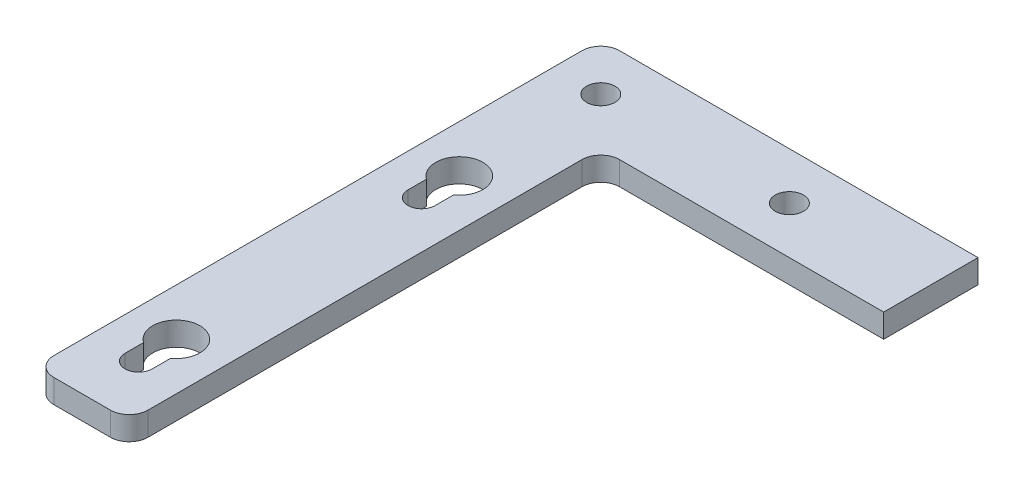
ISO-10303-21;
HEADER;
FILE_DESCRIPTION(('STEP AP214'),'2;1');
FILE_NAME('part.step','',(''),(''),'','','');
FILE_SCHEMA(('AUTOMOTIVE_DESIGN { 1 0 10303 214 1 1 1 1 }'));
ENDSEC;
DATA;
#1=APPLICATION_CONTEXT('core data for automotive mechanical design processes');
#2=APPLICATION_PROTOCOL_DEFINITION('international standard','automotive_design',2000,#1);
#3=PRODUCT_CONTEXT('',#1,'mechanical');
#4=PRODUCT('Part','Part','',(#3));
#5=PRODUCT_RELATED_PRODUCT_CATEGORY('part','',(#4));
#6=PRODUCT_DEFINITION_FORMATION('','',#4);
#7=PRODUCT_DEFINITION_CONTEXT('part definition',#1,'design');
#8=PRODUCT_DEFINITION('design','',#6,#7);
#9=PRODUCT_DEFINITION_SHAPE('','',#8);
#10=(LENGTH_UNIT() NAMED_UNIT(*) SI_UNIT(.MILLI.,.METRE.));
#11=(NAMED_UNIT(*) PLANE_ANGLE_UNIT() SI_UNIT($,.RADIAN.));
#12=(NAMED_UNIT(*) SI_UNIT($,.STERADIAN.) SOLID_ANGLE_UNIT());
#13=UNCERTAINTY_MEASURE_WITH_UNIT(LENGTH_MEASURE(1.E-05),#10,'distance_accuracy_value','');
#14=(GEOMETRIC_REPRESENTATION_CONTEXT(3) GLOBAL_UNCERTAINTY_ASSIGNED_CONTEXT((#13)) GLOBAL_UNIT_ASSIGNED_CONTEXT((#10,
#11,#12)) REPRESENTATION_CONTEXT('',''));
#15=CARTESIAN_POINT('',(0.,0.,0.));
#16=DIRECTION('',(0.,0.,1.));
#17=DIRECTION('',(1.,0.,0.));
#18=AXIS2_PLACEMENT_3D('',#15,#16,#17);
#19=CARTESIAN_POINT('',(0.,3.175,-76.2));
#20=DIRECTION('',(0.,0.,-1.));
#21=DIRECTION('',(-1.,0.,0.));
#22=AXIS2_PLACEMENT_3D('',#19,#20,#21);
#23=PLANE('',#22);
#24=DIRECTION('',(1.,0.,0.));
#25=VECTOR('',#24,1.);
#26=CARTESIAN_POINT('',(0.,0.,-76.2));
#27=LINE('',#26,#25);
#28=CARTESIAN_POINT('',(2.54,0.,-76.2));
#29=VERTEX_POINT('',#28);
#30=CARTESIAN_POINT('',(50.8,0.,-76.2));
#31=VERTEX_POINT('',#30);
#32=EDGE_CURVE('E255',#29,#31,#27,.T.);
#33=ORIENTED_EDGE('',*,*,#32,.F.);
#34=DIRECTION('',(0.,-1.,0.));
#35=VECTOR('',#34,1.);
#36=CARTESIAN_POINT('',(2.54,3.175,-76.2));
#37=LINE('',#36,#35);
#38=CARTESIAN_POINT('',(2.54,3.175,-76.2));
#39=VERTEX_POINT('',#38);
#40=EDGE_CURVE('E322',#29,#39,#37,.F.);
#41=ORIENTED_EDGE('',*,*,#40,.T.);
#42=DIRECTION('',(1.,0.,0.));
#43=VECTOR('',#42,1.);
#44=CARTESIAN_POINT('',(0.,3.175,-76.2));
#45=LINE('',#44,#43);
#46=CARTESIAN_POINT('',(50.8,3.175,-76.2));
#47=VERTEX_POINT('',#46);
#48=EDGE_CURVE('E258',#39,#47,#45,.T.);
#49=ORIENTED_EDGE('',*,*,#48,.T.);
#50=DIRECTION('',(0.,-1.,0.));
#51=VECTOR('',#50,1.);
#52=CARTESIAN_POINT('',(50.8,3.175,-76.2));
#53=LINE('',#52,#51);
#54=EDGE_CURVE('E274',#47,#31,#53,.T.);
#55=ORIENTED_EDGE('',*,*,#54,.T.);
#56=EDGE_LOOP('',(#33,#41,#49,#55));
#57=FACE_BOUND('',#56,.T.);
#58=ADVANCED_FACE('F49',(#57),#23,.T.);
#59=CARTESIAN_POINT('',(0.,3.175,0.));
#60=DIRECTION('',(-1.,0.,0.));
#61=DIRECTION('',(0.,0.,1.));
#62=AXIS2_PLACEMENT_3D('',#59,#60,#61);
#63=PLANE('',#62);
#64=DIRECTION('',(0.,0.,-1.));
#65=VECTOR('',#64,1.);
#66=CARTESIAN_POINT('',(0.,0.,0.));
#67=LINE('',#66,#65);
#68=CARTESIAN_POINT('',(0.,0.,-2.54));
#69=VERTEX_POINT('',#68);
#70=CARTESIAN_POINT('',(0.,0.,-73.66));
#71=VERTEX_POINT('',#70);
#72=EDGE_CURVE('E276',#69,#71,#67,.T.);
#73=ORIENTED_EDGE('',*,*,#72,.F.);
#74=DIRECTION('',(0.,-1.,0.));
#75=VECTOR('',#74,1.);
#76=CARTESIAN_POINT('',(0.,3.175,-2.54));
#77=LINE('',#76,#75);
#78=CARTESIAN_POINT('',(0.,3.175,-2.54));
#79=VERTEX_POINT('',#78);
#80=EDGE_CURVE('E71',#69,#79,#77,.F.);
#81=ORIENTED_EDGE('',*,*,#80,.T.);
#82=DIRECTION('',(0.,0.,-1.));
#83=VECTOR('',#82,1.);
#84=CARTESIAN_POINT('',(0.,3.175,0.));
#85=LINE('',#84,#83);
#86=CARTESIAN_POINT('',(0.,3.175,-73.66));
#87=VERTEX_POINT('',#86);
#88=EDGE_CURVE('E260',#79,#87,#85,.T.);
#89=ORIENTED_EDGE('',*,*,#88,.T.);
#90=DIRECTION('',(0.,-1.,0.));
#91=VECTOR('',#90,1.);
#92=CARTESIAN_POINT('',(0.,3.175,-73.66));
#93=LINE('',#92,#91);
#94=EDGE_CURVE('E318',#87,#71,#93,.T.);
#95=ORIENTED_EDGE('',*,*,#94,.T.);
#96=EDGE_LOOP('',(#73,#81,#89,#95));
#97=FACE_BOUND('',#96,.T.);
#98=ADVANCED_FACE('F349',(#97),#63,.T.);
#99=CARTESIAN_POINT('',(0.,3.175,0.));
#100=DIRECTION('',(0.,0.,-1.));
#101=DIRECTION('',(-1.,0.,0.));
#102=AXIS2_PLACEMENT_3D('',#99,#100,#101);
#103=PLANE('',#102);
#104=DIRECTION('',(1.,0.,0.));
#105=VECTOR('',#104,1.);
#106=CARTESIAN_POINT('',(0.,0.,0.));
#107=LINE('',#106,#105);
#108=CARTESIAN_POINT('',(2.54,0.,0.));
#109=VERTEX_POINT('',#108);
#110=CARTESIAN_POINT('',(10.16,0.,0.));
#111=VERTEX_POINT('',#110);
#112=EDGE_CURVE('E279',#109,#111,#107,.T.);
#113=ORIENTED_EDGE('',*,*,#112,.T.);
#114=DIRECTION('',(0.,-1.,0.));
#115=VECTOR('',#114,1.);
#116=CARTESIAN_POINT('',(10.16,3.175,0.));
#117=LINE('',#116,#115);
#118=CARTESIAN_POINT('',(10.16,3.175,0.));
#119=VERTEX_POINT('',#118);
#120=EDGE_CURVE('E311',#111,#119,#117,.F.);
#121=ORIENTED_EDGE('',*,*,#120,.T.);
#122=DIRECTION('',(1.,0.,0.));
#123=VECTOR('',#122,1.);
#124=CARTESIAN_POINT('',(0.,3.175,0.));
#125=LINE('',#124,#123);
#126=CARTESIAN_POINT('',(2.54,3.175,0.));
#127=VERTEX_POINT('',#126);
#128=EDGE_CURVE('E263',#127,#119,#125,.T.);
#129=ORIENTED_EDGE('',*,*,#128,.F.);
#130=DIRECTION('',(0.,-1.,0.));
#131=VECTOR('',#130,1.);
#132=CARTESIAN_POINT('',(2.54,0.,0.));
#133=LINE('',#132,#131);
#134=EDGE_CURVE('E308',#127,#109,#133,.T.);
#135=ORIENTED_EDGE('',*,*,#134,.T.);
#136=EDGE_LOOP('',(#113,#121,#129,#135));
#137=FACE_BOUND('',#136,.T.);
#138=ADVANCED_FACE('F358',(#137),#103,.F.);
#139=CARTESIAN_POINT('',(12.7,3.175,0.));
#140=DIRECTION('',(-1.,0.,0.));
#141=DIRECTION('',(0.,0.,1.));
#142=AXIS2_PLACEMENT_3D('',#139,#140,#141);
#143=PLANE('',#142);
#144=DIRECTION('',(0.,0.,-1.));
#145=VECTOR('',#144,1.);
#146=CARTESIAN_POINT('',(12.7,0.,0.));
#147=LINE('',#146,#145);
#148=CARTESIAN_POINT('',(12.7,0.,-2.54));
#149=VERTEX_POINT('',#148);
#150=CARTESIAN_POINT('',(12.7,0.,-60.96));
#151=VERTEX_POINT('',#150);
#152=EDGE_CURVE('E282',#149,#151,#147,.T.);
#153=ORIENTED_EDGE('',*,*,#152,.T.);
#154=DIRECTION('',(0.,-1.,0.));
#155=VECTOR('',#154,1.);
#156=CARTESIAN_POINT('',(12.7,3.175,-60.96));
#157=LINE('',#156,#155);
#158=CARTESIAN_POINT('',(12.7,3.175,-60.96));
#159=VERTEX_POINT('',#158);
#160=EDGE_CURVE('E300',#151,#159,#157,.F.);
#161=ORIENTED_EDGE('',*,*,#160,.T.);
#162=DIRECTION('',(0.,0.,-1.));
#163=VECTOR('',#162,1.);
#164=CARTESIAN_POINT('',(12.7,3.175,0.));
#165=LINE('',#164,#163);
#166=CARTESIAN_POINT('',(12.7,3.175,-2.54));
#167=VERTEX_POINT('',#166);
#168=EDGE_CURVE('E266',#167,#159,#165,.T.);
#169=ORIENTED_EDGE('',*,*,#168,.F.);
#170=DIRECTION('',(0.,-1.,0.));
#171=VECTOR('',#170,1.);
#172=CARTESIAN_POINT('',(12.7,3.175,-2.54));
#173=LINE('',#172,#171);
#174=EDGE_CURVE('E297',#167,#149,#173,.T.);
#175=ORIENTED_EDGE('',*,*,#174,.T.);
#176=EDGE_LOOP('',(#153,#161,#169,#175));
#177=FACE_BOUND('',#176,.T.);
#178=ADVANCED_FACE('F331',(#177),#143,.F.);
#179=CARTESIAN_POINT('',(0.,3.175,-63.5));
#180=DIRECTION('',(0.,0.,-1.));
#181=DIRECTION('',(-1.,0.,0.));
#182=AXIS2_PLACEMENT_3D('',#179,#180,#181);
#183=PLANE('',#182);
#184=DIRECTION('',(1.,0.,0.));
#185=VECTOR('',#184,1.);
#186=CARTESIAN_POINT('',(0.,3.175,-63.5));
#187=LINE('',#186,#185);
#188=CARTESIAN_POINT('',(15.24,3.175,-63.5));
#189=VERTEX_POINT('',#188);
#190=CARTESIAN_POINT('',(50.8,3.175,-63.5));
#191=VERTEX_POINT('',#190);
#192=EDGE_CURVE('E269',#189,#191,#187,.T.);
#193=ORIENTED_EDGE('',*,*,#192,.F.);
#194=DIRECTION('',(0.,-1.,0.));
#195=VECTOR('',#194,1.);
#196=CARTESIAN_POINT('',(15.24,0.,-63.5));
#197=LINE('',#196,#195);
#198=CARTESIAN_POINT('',(15.24,0.,-63.5));
#199=VERTEX_POINT('',#198);
#200=EDGE_CURVE('E294',#189,#199,#197,.T.);
#201=ORIENTED_EDGE('',*,*,#200,.T.);
#202=DIRECTION('',(1.,0.,0.));
#203=VECTOR('',#202,1.);
#204=CARTESIAN_POINT('',(0.,0.,-63.5));
#205=LINE('',#204,#203);
#206=CARTESIAN_POINT('',(50.8,0.,-63.5));
#207=VERTEX_POINT('',#206);
#208=EDGE_CURVE('E285',#199,#207,#205,.T.);
#209=ORIENTED_EDGE('',*,*,#208,.T.);
#210=DIRECTION('',(0.,-1.,0.));
#211=VECTOR('',#210,1.);
#212=CARTESIAN_POINT('',(50.8,3.175,-63.5));
#213=LINE('',#212,#211);
#214=EDGE_CURVE('E291',#191,#207,#213,.T.);
#215=ORIENTED_EDGE('',*,*,#214,.F.);
#216=EDGE_LOOP('',(#193,#201,#209,#215));
#217=FACE_BOUND('',#216,.T.);
#218=ADVANCED_FACE('F340',(#217),#183,.F.);
#219=CARTESIAN_POINT('',(50.8,3.175,0.));
#220=DIRECTION('',(1.,0.,0.));
#221=DIRECTION('',(0.,0.,-1.));
#222=AXIS2_PLACEMENT_3D('',#219,#220,#221);
#223=PLANE('',#222);
#224=DIRECTION('',(0.,0.,1.));
#225=VECTOR('',#224,1.);
#226=CARTESIAN_POINT('',(50.8,0.,0.));
#227=LINE('',#226,#225);
#228=EDGE_CURVE('E261',#31,#207,#227,.T.);
#229=ORIENTED_EDGE('',*,*,#228,.F.);
#230=ORIENTED_EDGE('',*,*,#54,.F.);
#231=DIRECTION('',(0.,0.,1.));
#232=VECTOR('',#231,1.);
#233=CARTESIAN_POINT('',(50.8,3.175,0.));
#234=LINE('',#233,#232);
#235=EDGE_CURVE('E271',#47,#191,#234,.T.);
#236=ORIENTED_EDGE('',*,*,#235,.T.);
#237=ORIENTED_EDGE('',*,*,#214,.T.);
#238=EDGE_LOOP('',(#229,#230,#236,#237));
#239=FACE_BOUND('',#238,.T.);
#240=ADVANCED_FACE('F344',(#239),#223,.T.);
#241=CARTESIAN_POINT('',(0.,3.175,0.));
#242=DIRECTION('',(0.,1.,0.));
#243=DIRECTION('',(0.,0.,1.));
#244=AXIS2_PLACEMENT_3D('',#241,#242,#243);
#245=PLANE('',#244);
#246=CARTESIAN_POINT('',(6.34999999999999,3.175,-50.8));
#247=DIRECTION('',(0.,1.,0.));
#248=DIRECTION('',(0.,0.,1.));
#249=AXIS2_PLACEMENT_3D('',#246,#247,#248);
#250=CIRCLE('',#249,3.175);
#251=CARTESIAN_POINT('',(8.1788,3.175,-48.2045972258626));
#252=VERTEX_POINT('',#251);
#253=CARTESIAN_POINT('',(4.5212,3.175,-48.2045972258626));
#254=VERTEX_POINT('',#253);
#255=EDGE_CURVE('E200',#252,#254,#250,.T.);
#256=ORIENTED_EDGE('',*,*,#255,.F.);
#257=DIRECTION('',(0.,0.,-1.));
#258=VECTOR('',#257,1.);
#259=CARTESIAN_POINT('',(8.17880000000003,3.175,0.));
#260=LINE('',#259,#258);
#261=CARTESIAN_POINT('',(8.1788,3.175,-45.72));
#262=VERTEX_POINT('',#261);
#263=EDGE_CURVE('E179',#262,#252,#260,.T.);
#264=ORIENTED_EDGE('',*,*,#263,.F.);
#265=CARTESIAN_POINT('',(6.34999999999999,3.175,-45.72));
#266=DIRECTION('',(0.,1.,0.));
#267=DIRECTION('',(0.,0.,1.));
#268=AXIS2_PLACEMENT_3D('',#265,#266,#267);
#269=CIRCLE('',#268,1.8288);
#270=CARTESIAN_POINT('',(4.52119999999999,3.175,-45.72));
#271=VERTEX_POINT('',#270);
#272=EDGE_CURVE('E190',#271,#262,#269,.T.);
#273=ORIENTED_EDGE('',*,*,#272,.F.);
#274=DIRECTION('',(0.,0.,-1.));
#275=VECTOR('',#274,1.);
#276=CARTESIAN_POINT('',(4.52119999999998,3.175,0.));
#277=LINE('',#276,#275);
#278=EDGE_CURVE('E203',#271,#254,#277,.T.);
#279=ORIENTED_EDGE('',*,*,#278,.T.);
#280=EDGE_LOOP('',(#256,#264,#273,#279));
#281=FACE_BOUND('',#280,.T.);
#282=DIRECTION('',(0.,0.,-1.));
#283=VECTOR('',#282,1.);
#284=CARTESIAN_POINT('',(8.1788,3.175,0.));
#285=LINE('',#284,#283);
#286=CARTESIAN_POINT('',(8.1788,3.175,-7.62));
#287=VERTEX_POINT('',#286);
#288=CARTESIAN_POINT('',(8.1788,3.175,-10.1045972258626));
#289=VERTEX_POINT('',#288);
#290=EDGE_CURVE('E233',#287,#289,#285,.T.);
#291=ORIENTED_EDGE('',*,*,#290,.F.);
#292=CARTESIAN_POINT('',(6.35,3.175,-7.62));
#293=DIRECTION('',(0.,1.,0.));
#294=DIRECTION('',(0.,0.,1.));
#295=AXIS2_PLACEMENT_3D('',#292,#293,#294);
#296=CIRCLE('',#295,1.8288);
#297=CARTESIAN_POINT('',(4.5212,3.175,-7.62));
#298=VERTEX_POINT('',#297);
#299=EDGE_CURVE('E223',#298,#287,#296,.T.);
#300=ORIENTED_EDGE('',*,*,#299,.F.);
#301=DIRECTION('',(0.,0.,-1.));
#302=VECTOR('',#301,1.);
#303=CARTESIAN_POINT('',(4.52119999999999,3.175,0.));
#304=LINE('',#303,#302);
#305=CARTESIAN_POINT('',(4.52119999999999,3.175,-10.1045972258626));
#306=VERTEX_POINT('',#305);
#307=EDGE_CURVE('E226',#298,#306,#304,.T.);
#308=ORIENTED_EDGE('',*,*,#307,.T.);
#309=CARTESIAN_POINT('',(6.35,3.175,-12.7));
#310=DIRECTION('',(0.,1.,0.));
#311=DIRECTION('',(0.,0.,1.));
#312=AXIS2_PLACEMENT_3D('',#309,#310,#311);
#313=CIRCLE('',#312,3.175);
#314=EDGE_CURVE('E230',#289,#306,#313,.T.);
#315=ORIENTED_EDGE('',*,*,#314,.F.);
#316=EDGE_LOOP('',(#291,#300,#308,#315));
#317=FACE_BOUND('',#316,.T.);
#318=CARTESIAN_POINT('',(31.75,3.175,-69.85));
#319=DIRECTION('',(0.,1.,0.));
#320=DIRECTION('',(0.,0.,1.));
#321=AXIS2_PLACEMENT_3D('',#318,#319,#320);
#322=CIRCLE('',#321,1.90500000000001);
#323=CARTESIAN_POINT('',(31.75,3.175,-67.945));
#324=VERTEX_POINT('',#323);
#325=EDGE_CURVE('E246',#324,#324,#322,.T.);
#326=ORIENTED_EDGE('',*,*,#325,.F.);
#327=EDGE_LOOP('',(#326));
#328=FACE_BOUND('',#327,.T.);
#329=CARTESIAN_POINT('',(6.35,3.175,-69.85));
#330=DIRECTION('',(0.,1.,0.));
#331=DIRECTION('',(0.,0.,1.));
#332=AXIS2_PLACEMENT_3D('',#329,#330,#331);
#333=CIRCLE('',#332,1.90500000000001);
#334=CARTESIAN_POINT('',(6.35,3.175,-67.945));
#335=VERTEX_POINT('',#334);
#336=EDGE_CURVE('E249',#335,#335,#333,.T.);
#337=ORIENTED_EDGE('',*,*,#336,.F.);
#338=EDGE_LOOP('',(#337));
#339=FACE_BOUND('',#338,.T.);
#340=ORIENTED_EDGE('',*,*,#128,.T.);
#341=CARTESIAN_POINT('',(10.16,3.175,-2.54));
#342=DIRECTION('',(0.,1.,0.));
#343=DIRECTION('',(0.,0.,1.));
#344=AXIS2_PLACEMENT_3D('',#341,#342,#343);
#345=CIRCLE('',#344,2.54);
#346=EDGE_CURVE('E316',#119,#167,#345,.T.);
#347=ORIENTED_EDGE('',*,*,#346,.T.);
#348=ORIENTED_EDGE('',*,*,#168,.T.);
#349=CARTESIAN_POINT('',(15.24,3.175,-60.96));
#350=DIRECTION('',(0.,1.,0.));
#351=DIRECTION('',(0.,0.,1.));
#352=AXIS2_PLACEMENT_3D('',#349,#350,#351);
#353=CIRCLE('',#352,2.54);
#354=EDGE_CURVE('E12',#159,#189,#353,.F.);
#355=ORIENTED_EDGE('',*,*,#354,.T.);
#356=ORIENTED_EDGE('',*,*,#192,.T.);
#357=ORIENTED_EDGE('',*,*,#235,.F.);
#358=ORIENTED_EDGE('',*,*,#48,.F.);
#359=CARTESIAN_POINT('',(2.54,3.175,-73.66));
#360=DIRECTION('',(0.,1.,0.));
#361=DIRECTION('',(0.,0.,1.));
#362=AXIS2_PLACEMENT_3D('',#359,#360,#361);
#363=CIRCLE('',#362,2.54);
#364=EDGE_CURVE('E64',#39,#87,#363,.T.);
#365=ORIENTED_EDGE('',*,*,#364,.T.);
#366=ORIENTED_EDGE('',*,*,#88,.F.);
#367=CARTESIAN_POINT('',(2.54,3.175,-2.54));
#368=DIRECTION('',(0.,1.,0.));
#369=DIRECTION('',(0.,0.,1.));
#370=AXIS2_PLACEMENT_3D('',#367,#368,#369);
#371=CIRCLE('',#370,2.54);
#372=EDGE_CURVE('E314',#79,#127,#371,.T.);
#373=ORIENTED_EDGE('',*,*,#372,.T.);
#374=EDGE_LOOP('',(#340,#347,#348,#355,#356,#357,#358,#365,#366,#373));
#375=FACE_BOUND('',#374,.T.);
#376=ADVANCED_FACE('F197',(#281,#317,#328,#339,#375),#245,.T.);
#377=CARTESIAN_POINT('',(0.,0.,0.));
#378=DIRECTION('',(0.,1.,0.));
#379=DIRECTION('',(0.,0.,1.));
#380=AXIS2_PLACEMENT_3D('',#377,#378,#379);
#381=PLANE('',#380);
#382=DIRECTION('',(0.,0.,-1.));
#383=VECTOR('',#382,1.);
#384=CARTESIAN_POINT('',(8.17880000000003,0.,0.));
#385=LINE('',#384,#383);
#386=CARTESIAN_POINT('',(8.1788,0.,-45.72));
#387=VERTEX_POINT('',#386);
#388=CARTESIAN_POINT('',(8.1788,0.,-48.2045972258626));
#389=VERTEX_POINT('',#388);
#390=EDGE_CURVE('E182',#387,#389,#385,.T.);
#391=ORIENTED_EDGE('',*,*,#390,.T.);
#392=CARTESIAN_POINT('',(6.34999999999999,0.,-50.8));
#393=DIRECTION('',(0.,1.,0.));
#394=DIRECTION('',(0.,0.,1.));
#395=AXIS2_PLACEMENT_3D('',#392,#393,#394);
#396=CIRCLE('',#395,3.175);
#397=CARTESIAN_POINT('',(4.5212,0.,-48.2045972258626));
#398=VERTEX_POINT('',#397);
#399=EDGE_CURVE('E209',#389,#398,#396,.T.);
#400=ORIENTED_EDGE('',*,*,#399,.T.);
#401=DIRECTION('',(0.,0.,-1.));
#402=VECTOR('',#401,1.);
#403=CARTESIAN_POINT('',(4.52119999999998,0.,0.));
#404=LINE('',#403,#402);
#405=CARTESIAN_POINT('',(4.52119999999999,0.,-45.72));
#406=VERTEX_POINT('',#405);
#407=EDGE_CURVE('E207',#406,#398,#404,.T.);
#408=ORIENTED_EDGE('',*,*,#407,.F.);
#409=CARTESIAN_POINT('',(6.34999999999999,0.,-45.72));
#410=DIRECTION('',(0.,1.,0.));
#411=DIRECTION('',(0.,0.,1.));
#412=AXIS2_PLACEMENT_3D('',#409,#410,#411);
#413=CIRCLE('',#412,1.8288);
#414=EDGE_CURVE('E195',#406,#387,#413,.T.);
#415=ORIENTED_EDGE('',*,*,#414,.T.);
#416=EDGE_LOOP('',(#391,#400,#408,#415));
#417=FACE_BOUND('',#416,.T.);
#418=CARTESIAN_POINT('',(6.35,0.,-7.62));
#419=DIRECTION('',(0.,1.,0.));
#420=DIRECTION('',(0.,0.,1.));
#421=AXIS2_PLACEMENT_3D('',#418,#419,#420);
#422=CIRCLE('',#421,1.8288);
#423=CARTESIAN_POINT('',(4.5212,0.,-7.62));
#424=VERTEX_POINT('',#423);
#425=CARTESIAN_POINT('',(8.1788,0.,-7.62));
#426=VERTEX_POINT('',#425);
#427=EDGE_CURVE('E217',#424,#426,#422,.T.);
#428=ORIENTED_EDGE('',*,*,#427,.T.);
#429=DIRECTION('',(0.,0.,-1.));
#430=VECTOR('',#429,1.);
#431=CARTESIAN_POINT('',(8.1788,0.,0.));
#432=LINE('',#431,#430);
#433=CARTESIAN_POINT('',(8.1788,0.,-10.1045972258626));
#434=VERTEX_POINT('',#433);
#435=EDGE_CURVE('E227',#426,#434,#432,.T.);
#436=ORIENTED_EDGE('',*,*,#435,.T.);
#437=CARTESIAN_POINT('',(6.35,0.,-12.7));
#438=DIRECTION('',(0.,1.,0.));
#439=DIRECTION('',(0.,0.,1.));
#440=AXIS2_PLACEMENT_3D('',#437,#438,#439);
#441=CIRCLE('',#440,3.175);
#442=CARTESIAN_POINT('',(4.52119999999999,0.,-10.1045972258626));
#443=VERTEX_POINT('',#442);
#444=EDGE_CURVE('E241',#434,#443,#441,.T.);
#445=ORIENTED_EDGE('',*,*,#444,.T.);
#446=DIRECTION('',(0.,0.,-1.));
#447=VECTOR('',#446,1.);
#448=CARTESIAN_POINT('',(4.52119999999999,0.,0.));
#449=LINE('',#448,#447);
#450=EDGE_CURVE('E238',#424,#443,#449,.T.);
#451=ORIENTED_EDGE('',*,*,#450,.F.);
#452=EDGE_LOOP('',(#428,#436,#445,#451));
#453=FACE_BOUND('',#452,.T.);
#454=CARTESIAN_POINT('',(31.75,0.,-69.85));
#455=DIRECTION('',(0.,1.,0.));
#456=DIRECTION('',(0.,0.,1.));
#457=AXIS2_PLACEMENT_3D('',#454,#455,#456);
#458=CIRCLE('',#457,1.90500000000001);
#459=CARTESIAN_POINT('',(31.75,0.,-67.945));
#460=VERTEX_POINT('',#459);
#461=EDGE_CURVE('E235',#460,#460,#458,.T.);
#462=ORIENTED_EDGE('',*,*,#461,.T.);
#463=EDGE_LOOP('',(#462));
#464=FACE_BOUND('',#463,.T.);
#465=CARTESIAN_POINT('',(6.35,0.,-69.85));
#466=DIRECTION('',(0.,1.,0.));
#467=DIRECTION('',(0.,0.,1.));
#468=AXIS2_PLACEMENT_3D('',#465,#466,#467);
#469=CIRCLE('',#468,1.90500000000001);
#470=CARTESIAN_POINT('',(6.35,0.,-67.945));
#471=VERTEX_POINT('',#470);
#472=EDGE_CURVE('E252',#471,#471,#469,.T.);
#473=ORIENTED_EDGE('',*,*,#472,.T.);
#474=EDGE_LOOP('',(#473));
#475=FACE_BOUND('',#474,.T.);
#476=ORIENTED_EDGE('',*,*,#152,.F.);
#477=CARTESIAN_POINT('',(10.16,0.,-2.54));
#478=DIRECTION('',(0.,1.,0.));
#479=DIRECTION('',(0.,0.,1.));
#480=AXIS2_PLACEMENT_3D('',#477,#478,#479);
#481=CIRCLE('',#480,2.54);
#482=EDGE_CURVE('E306',#149,#111,#481,.F.);
#483=ORIENTED_EDGE('',*,*,#482,.T.);
#484=ORIENTED_EDGE('',*,*,#112,.F.);
#485=CARTESIAN_POINT('',(2.54,0.,-2.54));
#486=DIRECTION('',(0.,1.,0.));
#487=DIRECTION('',(0.,0.,1.));
#488=AXIS2_PLACEMENT_3D('',#485,#486,#487);
#489=CIRCLE('',#488,2.54);
#490=EDGE_CURVE('E304',#109,#69,#489,.F.);
#491=ORIENTED_EDGE('',*,*,#490,.T.);
#492=ORIENTED_EDGE('',*,*,#72,.T.);
#493=CARTESIAN_POINT('',(2.54,0.,-73.66));
#494=DIRECTION('',(0.,1.,0.));
#495=DIRECTION('',(0.,0.,1.));
#496=AXIS2_PLACEMENT_3D('',#493,#494,#495);
#497=CIRCLE('',#496,2.54);
#498=EDGE_CURVE('E302',#71,#29,#497,.F.);
#499=ORIENTED_EDGE('',*,*,#498,.T.);
#500=ORIENTED_EDGE('',*,*,#32,.T.);
#501=ORIENTED_EDGE('',*,*,#228,.T.);
#502=ORIENTED_EDGE('',*,*,#208,.F.);
#503=CARTESIAN_POINT('',(15.24,0.,-60.96));
#504=DIRECTION('',(0.,1.,0.));
#505=DIRECTION('',(0.,0.,1.));
#506=AXIS2_PLACEMENT_3D('',#503,#504,#505);
#507=CIRCLE('',#506,2.54);
#508=EDGE_CURVE('E57',#199,#151,#507,.T.);
#509=ORIENTED_EDGE('',*,*,#508,.T.);
#510=EDGE_LOOP('',(#476,#483,#484,#491,#492,#499,#500,#501,#502,#509));
#511=FACE_BOUND('',#510,.T.);
#512=ADVANCED_FACE('F326',(#417,#453,#464,#475,#511),#381,.F.);
#513=CARTESIAN_POINT('',(6.35,0.,-69.85));
#514=DIRECTION('',(0.,1.,0.));
#515=DIRECTION('',(0.,0.,1.));
#516=AXIS2_PLACEMENT_3D('',#513,#514,#515);
#517=CYLINDRICAL_SURFACE('',#516,1.90500000000001);
#518=ORIENTED_EDGE('',*,*,#472,.F.);
#519=EDGE_LOOP('',(#518));
#520=FACE_BOUND('',#519,.T.);
#521=ORIENTED_EDGE('',*,*,#336,.T.);
#522=EDGE_LOOP('',(#521));
#523=FACE_BOUND('',#522,.T.);
#524=ADVANCED_FACE('F388',(#520,#523),#517,.F.);
#525=CARTESIAN_POINT('',(31.75,0.,-69.85));
#526=DIRECTION('',(0.,1.,0.));
#527=DIRECTION('',(0.,0.,1.));
#528=AXIS2_PLACEMENT_3D('',#525,#526,#527);
#529=CYLINDRICAL_SURFACE('',#528,1.90500000000001);
#530=ORIENTED_EDGE('',*,*,#461,.F.);
#531=EDGE_LOOP('',(#530));
#532=FACE_BOUND('',#531,.T.);
#533=ORIENTED_EDGE('',*,*,#325,.T.);
#534=EDGE_LOOP('',(#533));
#535=FACE_BOUND('',#534,.T.);
#536=ADVANCED_FACE('F394',(#532,#535),#529,.F.);
#537=CARTESIAN_POINT('',(8.1788,0.,0.));
#538=DIRECTION('',(1.,0.,0.));
#539=DIRECTION('',(0.,0.,-1.));
#540=AXIS2_PLACEMENT_3D('',#537,#538,#539);
#541=PLANE('',#540);
#542=ORIENTED_EDGE('',*,*,#290,.T.);
#543=DIRECTION('',(0.,1.,0.));
#544=VECTOR('',#543,1.);
#545=CARTESIAN_POINT('',(8.1788,0.,-10.1045972258626));
#546=LINE('',#545,#544);
#547=EDGE_CURVE('E214',#434,#289,#546,.T.);
#548=ORIENTED_EDGE('',*,*,#547,.F.);
#549=ORIENTED_EDGE('',*,*,#435,.F.);
#550=DIRECTION('',(0.,1.,0.));
#551=VECTOR('',#550,1.);
#552=CARTESIAN_POINT('',(8.1788,0.,-7.62));
#553=LINE('',#552,#551);
#554=EDGE_CURVE('E194',#426,#287,#553,.T.);
#555=ORIENTED_EDGE('',*,*,#554,.T.);
#556=EDGE_LOOP('',(#542,#548,#549,#555));
#557=FACE_BOUND('',#556,.T.);
#558=ADVANCED_FACE('F398',(#557),#541,.F.);
#559=CARTESIAN_POINT('',(6.35,0.,-7.62));
#560=DIRECTION('',(0.,1.,0.));
#561=DIRECTION('',(0.,0.,1.));
#562=AXIS2_PLACEMENT_3D('',#559,#560,#561);
#563=CYLINDRICAL_SURFACE('',#562,1.8288);
#564=ORIENTED_EDGE('',*,*,#299,.T.);
#565=ORIENTED_EDGE('',*,*,#554,.F.);
#566=ORIENTED_EDGE('',*,*,#427,.F.);
#567=DIRECTION('',(0.,1.,0.));
#568=VECTOR('',#567,1.);
#569=CARTESIAN_POINT('',(4.5212,0.,-7.62));
#570=LINE('',#569,#568);
#571=EDGE_CURVE('E220',#424,#298,#570,.T.);
#572=ORIENTED_EDGE('',*,*,#571,.T.);
#573=EDGE_LOOP('',(#564,#565,#566,#572));
#574=FACE_BOUND('',#573,.T.);
#575=ADVANCED_FACE('F400',(#574),#563,.F.);
#576=CARTESIAN_POINT('',(4.52119999999999,0.,0.));
#577=DIRECTION('',(1.,0.,0.));
#578=DIRECTION('',(0.,0.,-1.));
#579=AXIS2_PLACEMENT_3D('',#576,#577,#578);
#580=PLANE('',#579);
#581=ORIENTED_EDGE('',*,*,#307,.F.);
#582=ORIENTED_EDGE('',*,*,#571,.F.);
#583=ORIENTED_EDGE('',*,*,#450,.T.);
#584=DIRECTION('',(0.,1.,0.));
#585=VECTOR('',#584,1.);
#586=CARTESIAN_POINT('',(4.52119999999999,0.,-10.1045972258626));
#587=LINE('',#586,#585);
#588=EDGE_CURVE('E218',#443,#306,#587,.T.);
#589=ORIENTED_EDGE('',*,*,#588,.T.);
#590=EDGE_LOOP('',(#581,#582,#583,#589));
#591=FACE_BOUND('',#590,.T.);
#592=ADVANCED_FACE('F403',(#591),#580,.T.);
#593=CARTESIAN_POINT('',(6.35,0.,-12.7));
#594=DIRECTION('',(0.,1.,0.));
#595=DIRECTION('',(0.,0.,1.));
#596=AXIS2_PLACEMENT_3D('',#593,#594,#595);
#597=CYLINDRICAL_SURFACE('',#596,3.175);
#598=ORIENTED_EDGE('',*,*,#314,.T.);
#599=ORIENTED_EDGE('',*,*,#588,.F.);
#600=ORIENTED_EDGE('',*,*,#444,.F.);
#601=ORIENTED_EDGE('',*,*,#547,.T.);
#602=EDGE_LOOP('',(#598,#599,#600,#601));
#603=FACE_BOUND('',#602,.T.);
#604=ADVANCED_FACE('F407',(#603),#597,.F.);
#605=CARTESIAN_POINT('',(8.17880000000003,0.,0.));
#606=DIRECTION('',(1.,0.,0.));
#607=DIRECTION('',(0.,0.,-1.));
#608=AXIS2_PLACEMENT_3D('',#605,#606,#607);
#609=PLANE('',#608);
#610=ORIENTED_EDGE('',*,*,#263,.T.);
#611=DIRECTION('',(0.,1.,0.));
#612=VECTOR('',#611,1.);
#613=CARTESIAN_POINT('',(8.1788,0.,-48.2045972258626));
#614=LINE('',#613,#612);
#615=EDGE_CURVE('E210',#389,#252,#614,.T.);
#616=ORIENTED_EDGE('',*,*,#615,.F.);
#617=ORIENTED_EDGE('',*,*,#390,.F.);
#618=DIRECTION('',(0.,1.,0.));
#619=VECTOR('',#618,1.);
#620=CARTESIAN_POINT('',(8.1788,0.,-45.72));
#621=LINE('',#620,#619);
#622=EDGE_CURVE('E175',#387,#262,#621,.T.);
#623=ORIENTED_EDGE('',*,*,#622,.T.);
#624=EDGE_LOOP('',(#610,#616,#617,#623));
#625=FACE_BOUND('',#624,.T.);
#626=ADVANCED_FACE('F177',(#625),#609,.F.);
#627=CARTESIAN_POINT('',(4.52119999999998,0.,0.));
#628=DIRECTION('',(1.,0.,0.));
#629=DIRECTION('',(0.,0.,-1.));
#630=AXIS2_PLACEMENT_3D('',#627,#628,#629);
#631=PLANE('',#630);
#632=ORIENTED_EDGE('',*,*,#278,.F.);
#633=DIRECTION('',(0.,1.,0.));
#634=VECTOR('',#633,1.);
#635=CARTESIAN_POINT('',(4.52119999999999,0.,-45.72));
#636=LINE('',#635,#634);
#637=EDGE_CURVE('E186',#406,#271,#636,.T.);
#638=ORIENTED_EDGE('',*,*,#637,.F.);
#639=ORIENTED_EDGE('',*,*,#407,.T.);
#640=DIRECTION('',(0.,1.,0.));
#641=VECTOR('',#640,1.);
#642=CARTESIAN_POINT('',(4.5212,0.,-48.2045972258626));
#643=LINE('',#642,#641);
#644=EDGE_CURVE('E577',#398,#254,#643,.T.);
#645=ORIENTED_EDGE('',*,*,#644,.T.);
#646=EDGE_LOOP('',(#632,#638,#639,#645));
#647=FACE_BOUND('',#646,.T.);
#648=ADVANCED_FACE('F415',(#647),#631,.T.);
#649=CARTESIAN_POINT('',(6.34999999999999,0.,-50.8));
#650=DIRECTION('',(0.,1.,0.));
#651=DIRECTION('',(0.,0.,1.));
#652=AXIS2_PLACEMENT_3D('',#649,#650,#651);
#653=CYLINDRICAL_SURFACE('',#652,3.175);
#654=ORIENTED_EDGE('',*,*,#255,.T.);
#655=ORIENTED_EDGE('',*,*,#644,.F.);
#656=ORIENTED_EDGE('',*,*,#399,.F.);
#657=ORIENTED_EDGE('',*,*,#615,.T.);
#658=EDGE_LOOP('',(#654,#655,#656,#657));
#659=FACE_BOUND('',#658,.T.);
#660=ADVANCED_FACE('F370',(#659),#653,.F.);
#661=CARTESIAN_POINT('',(6.34999999999999,0.,-45.72));
#662=DIRECTION('',(0.,1.,0.));
#663=DIRECTION('',(0.,0.,1.));
#664=AXIS2_PLACEMENT_3D('',#661,#662,#663);
#665=CYLINDRICAL_SURFACE('',#664,1.8288);
#666=ORIENTED_EDGE('',*,*,#414,.F.);
#667=ORIENTED_EDGE('',*,*,#637,.T.);
#668=ORIENTED_EDGE('',*,*,#272,.T.);
#669=ORIENTED_EDGE('',*,*,#622,.F.);
#670=EDGE_LOOP('',(#666,#667,#668,#669));
#671=FACE_BOUND('',#670,.T.);
#672=ADVANCED_FACE('F191',(#671),#665,.F.);
#673=CARTESIAN_POINT('',(15.24,3.175,-60.96));
#674=DIRECTION('',(0.,1.,0.));
#675=DIRECTION('',(0.,0.,1.));
#676=AXIS2_PLACEMENT_3D('',#673,#674,#675);
#677=CYLINDRICAL_SURFACE('',#676,2.54);
#678=ORIENTED_EDGE('',*,*,#354,.F.);
#679=ORIENTED_EDGE('',*,*,#160,.F.);
#680=ORIENTED_EDGE('',*,*,#508,.F.);
#681=ORIENTED_EDGE('',*,*,#200,.F.);
#682=EDGE_LOOP('',(#678,#679,#680,#681));
#683=FACE_BOUND('',#682,.T.);
#684=ADVANCED_FACE('F335',(#683),#677,.F.);
#685=CARTESIAN_POINT('',(10.16,3.175,-2.54));
#686=DIRECTION('',(0.,-1.,0.));
#687=DIRECTION('',(0.,0.,-1.));
#688=AXIS2_PLACEMENT_3D('',#685,#686,#687);
#689=CYLINDRICAL_SURFACE('',#688,2.54);
#690=ORIENTED_EDGE('',*,*,#346,.F.);
#691=ORIENTED_EDGE('',*,*,#120,.F.);
#692=ORIENTED_EDGE('',*,*,#482,.F.);
#693=ORIENTED_EDGE('',*,*,#174,.F.);
#694=EDGE_LOOP('',(#690,#691,#692,#693));
#695=FACE_BOUND('',#694,.T.);
#696=ADVANCED_FACE('F362',(#695),#689,.T.);
#697=CARTESIAN_POINT('',(2.54,3.175,-2.54));
#698=DIRECTION('',(0.,1.,0.));
#699=DIRECTION('',(0.,0.,1.));
#700=AXIS2_PLACEMENT_3D('',#697,#698,#699);
#701=CYLINDRICAL_SURFACE('',#700,2.54);
#702=ORIENTED_EDGE('',*,*,#372,.F.);
#703=ORIENTED_EDGE('',*,*,#80,.F.);
#704=ORIENTED_EDGE('',*,*,#490,.F.);
#705=ORIENTED_EDGE('',*,*,#134,.F.);
#706=EDGE_LOOP('',(#702,#703,#704,#705));
#707=FACE_BOUND('',#706,.T.);
#708=ADVANCED_FACE('F355',(#707),#701,.T.);
#709=CARTESIAN_POINT('',(2.54,3.175,-73.66));
#710=DIRECTION('',(0.,-1.,0.));
#711=DIRECTION('',(0.,0.,-1.));
#712=AXIS2_PLACEMENT_3D('',#709,#710,#711);
#713=CYLINDRICAL_SURFACE('',#712,2.54);
#714=ORIENTED_EDGE('',*,*,#364,.F.);
#715=ORIENTED_EDGE('',*,*,#40,.F.);
#716=ORIENTED_EDGE('',*,*,#498,.F.);
#717=ORIENTED_EDGE('',*,*,#94,.F.);
#718=EDGE_LOOP('',(#714,#715,#716,#717));
#719=FACE_BOUND('',#718,.T.);
#720=ADVANCED_FACE('F51',(#719),#713,.T.);
#721=CLOSED_SHELL('',(#58,#98,#138,#178,#218,#240,#376,#512,#524,#536,#558,#575,#592,#604,#626,
#648,#660,#672,#684,#696,#708,#720));
#722=MANIFOLD_SOLID_BREP('B2',#721);
#723=ADVANCED_BREP_SHAPE_REPRESENTATION('',(#18,#722),#14);
#724=SHAPE_DEFINITION_REPRESENTATION(#9,#723);
ENDSEC;
END-ISO-10303-21;
